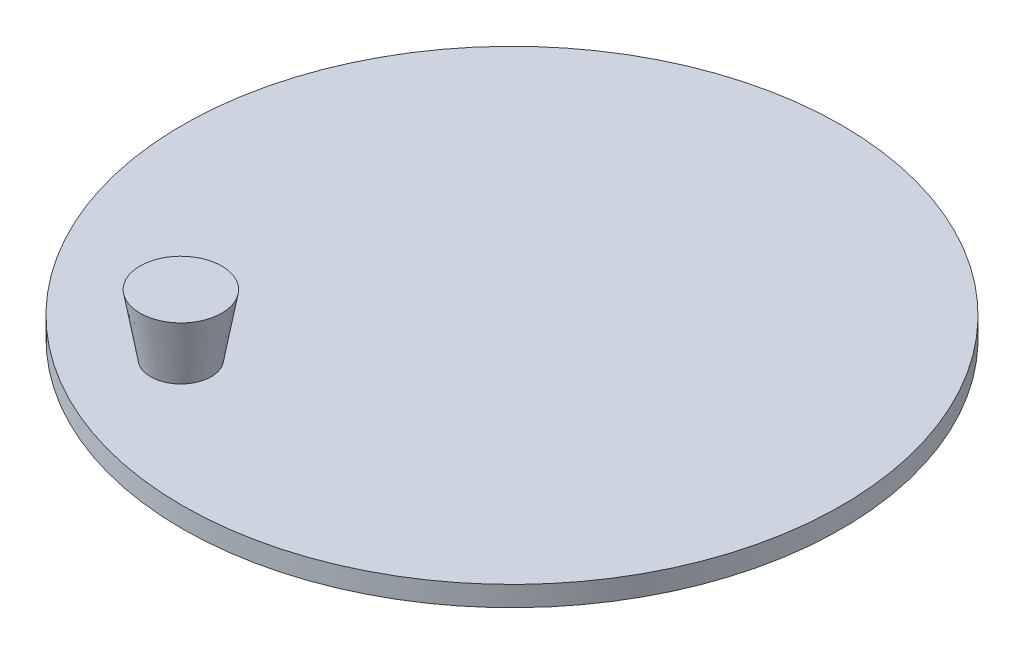
ISO-10303-21;
HEADER;
FILE_DESCRIPTION(('STEP AP214'),'2;1');
FILE_NAME('part.step','',(''),(''),'','','');
FILE_SCHEMA(('AUTOMOTIVE_DESIGN { 1 0 10303 214 1 1 1 1 }'));
ENDSEC;
DATA;
#1=APPLICATION_CONTEXT('core data for automotive mechanical design processes');
#2=APPLICATION_PROTOCOL_DEFINITION('international standard','automotive_design',2000,#1);
#3=PRODUCT_CONTEXT('',#1,'mechanical');
#4=PRODUCT('Part','Part','',(#3));
#5=PRODUCT_RELATED_PRODUCT_CATEGORY('part','',(#4));
#6=PRODUCT_DEFINITION_FORMATION('','',#4);
#7=PRODUCT_DEFINITION_CONTEXT('part definition',#1,'design');
#8=PRODUCT_DEFINITION('design','',#6,#7);
#9=PRODUCT_DEFINITION_SHAPE('','',#8);
#10=(LENGTH_UNIT() NAMED_UNIT(*) SI_UNIT(.MILLI.,.METRE.));
#11=(NAMED_UNIT(*) PLANE_ANGLE_UNIT() SI_UNIT($,.RADIAN.));
#12=(NAMED_UNIT(*) SI_UNIT($,.STERADIAN.) SOLID_ANGLE_UNIT());
#13=UNCERTAINTY_MEASURE_WITH_UNIT(LENGTH_MEASURE(1.E-05),#10,'distance_accuracy_value','');
#14=(GEOMETRIC_REPRESENTATION_CONTEXT(3) GLOBAL_UNCERTAINTY_ASSIGNED_CONTEXT((#13)) GLOBAL_UNIT_ASSIGNED_CONTEXT((#10,
#11,#12)) REPRESENTATION_CONTEXT('',''));
#15=CARTESIAN_POINT('',(0.,0.,0.));
#16=DIRECTION('',(0.,0.,1.));
#17=DIRECTION('',(1.,0.,0.));
#18=AXIS2_PLACEMENT_3D('',#15,#16,#17);
#19=CARTESIAN_POINT('',(0.,1.,0.));
#20=DIRECTION('',(0.,1.,0.));
#21=DIRECTION('',(0.,0.,1.));
#22=AXIS2_PLACEMENT_3D('',#19,#20,#21);
#23=PLANE('',#22);
#24=CARTESIAN_POINT('',(0.,1.,0.));
#25=DIRECTION('',(0.,1.,0.));
#26=DIRECTION('',(0.,0.,1.));
#27=AXIS2_PLACEMENT_3D('',#24,#25,#26);
#28=CIRCLE('',#27,16.35);
#29=CARTESIAN_POINT('',(0.,1.,16.35));
#30=VERTEX_POINT('',#29);
#31=EDGE_CURVE('E10',#30,#30,#28,.T.);
#32=ORIENTED_EDGE('',*,*,#31,.T.);
#33=EDGE_LOOP('',(#32));
#34=FACE_BOUND('',#33,.T.);
#35=CARTESIAN_POINT('',(-6.32168598625071,1.,10.1055132908456));
#36=DIRECTION('',(0.,1.,0.));
#37=DIRECTION('',(0.,0.,1.));
#38=AXIS2_PLACEMENT_3D('',#35,#36,#37);
#39=CIRCLE('',#38,1.49843170586713);
#40=CARTESIAN_POINT('',(-6.32168598625071,1.,11.6039449967128));
#41=VERTEX_POINT('',#40);
#42=EDGE_CURVE('E50',#41,#41,#39,.T.);
#43=ORIENTED_EDGE('',*,*,#42,.F.);
#44=EDGE_LOOP('',(#43));
#45=FACE_BOUND('',#44,.T.);
#46=ADVANCED_FACE('F35',(#34,#45),#23,.T.);
#47=CARTESIAN_POINT('',(0.,1.,0.));
#48=DIRECTION('',(0.,-1.,0.));
#49=DIRECTION('',(0.,0.,-1.));
#50=AXIS2_PLACEMENT_3D('',#47,#48,#49);
#51=CYLINDRICAL_SURFACE('',#50,16.35);
#52=ORIENTED_EDGE('',*,*,#31,.F.);
#53=EDGE_LOOP('',(#52));
#54=FACE_BOUND('',#53,.T.);
#55=CARTESIAN_POINT('',(0.,0.,0.));
#56=DIRECTION('',(0.,1.,0.));
#57=DIRECTION('',(0.,0.,1.));
#58=AXIS2_PLACEMENT_3D('',#55,#56,#57);
#59=CIRCLE('',#58,16.35);
#60=CARTESIAN_POINT('',(0.,0.,16.35));
#61=VERTEX_POINT('',#60);
#62=EDGE_CURVE('E39',#61,#61,#59,.T.);
#63=ORIENTED_EDGE('',*,*,#62,.T.);
#64=EDGE_LOOP('',(#63));
#65=FACE_BOUND('',#64,.T.);
#66=ADVANCED_FACE('F37',(#54,#65),#51,.T.);
#67=CARTESIAN_POINT('',(0.,0.,0.));
#68=DIRECTION('',(0.,1.,0.));
#69=DIRECTION('',(0.,0.,1.));
#70=AXIS2_PLACEMENT_3D('',#67,#68,#69);
#71=PLANE('',#70);
#72=ORIENTED_EDGE('',*,*,#62,.F.);
#73=EDGE_LOOP('',(#72));
#74=FACE_BOUND('',#73,.T.);
#75=ADVANCED_FACE('F61',(#74),#71,.F.);
#76=CARTESIAN_POINT('',(-6.32168598625071,1.,10.1055132908456));
#77=DIRECTION('',(0.,1.,0.));
#78=DIRECTION('',(0.,0.,1.));
#79=AXIS2_PLACEMENT_3D('',#76,#77,#78);
#80=CONICAL_SURFACE('',#79,1.49843170586713,0.174532925199433);
#81=CARTESIAN_POINT('',(-6.32168598625071,4.,10.1055132908456));
#82=DIRECTION('',(0.,1.,0.));
#83=DIRECTION('',(0.,0.,1.));
#84=AXIS2_PLACEMENT_3D('',#81,#82,#83);
#85=CIRCLE('',#84,2.02741264799253);
#86=CARTESIAN_POINT('',(-6.32168598625071,4.,12.1329259388382));
#87=VERTEX_POINT('',#86);
#88=EDGE_CURVE('E46',#87,#87,#85,.T.);
#89=ORIENTED_EDGE('',*,*,#88,.F.);
#90=EDGE_LOOP('',(#89));
#91=FACE_BOUND('',#90,.T.);
#92=ORIENTED_EDGE('',*,*,#42,.T.);
#93=EDGE_LOOP('',(#92));
#94=FACE_BOUND('',#93,.T.);
#95=ADVANCED_FACE('F54',(#91,#94),#80,.T.);
#96=CARTESIAN_POINT('',(-6.32168598625071,4.,10.1055132908456));
#97=DIRECTION('',(0.,1.,0.));
#98=DIRECTION('',(0.,0.,1.));
#99=AXIS2_PLACEMENT_3D('',#96,#97,#98);
#100=PLANE('',#99);
#101=ORIENTED_EDGE('',*,*,#88,.T.);
#102=EDGE_LOOP('',(#101));
#103=FACE_BOUND('',#102,.T.);
#104=ADVANCED_FACE('F70',(#103),#100,.T.);
#105=CLOSED_SHELL('',(#46,#66,#75,#95,#104));
#106=MANIFOLD_SOLID_BREP('B2',#105);
#107=ADVANCED_BREP_SHAPE_REPRESENTATION('',(#18,#106),#14);
#108=SHAPE_DEFINITION_REPRESENTATION(#9,#107);
ENDSEC;
END-ISO-10303-21;
